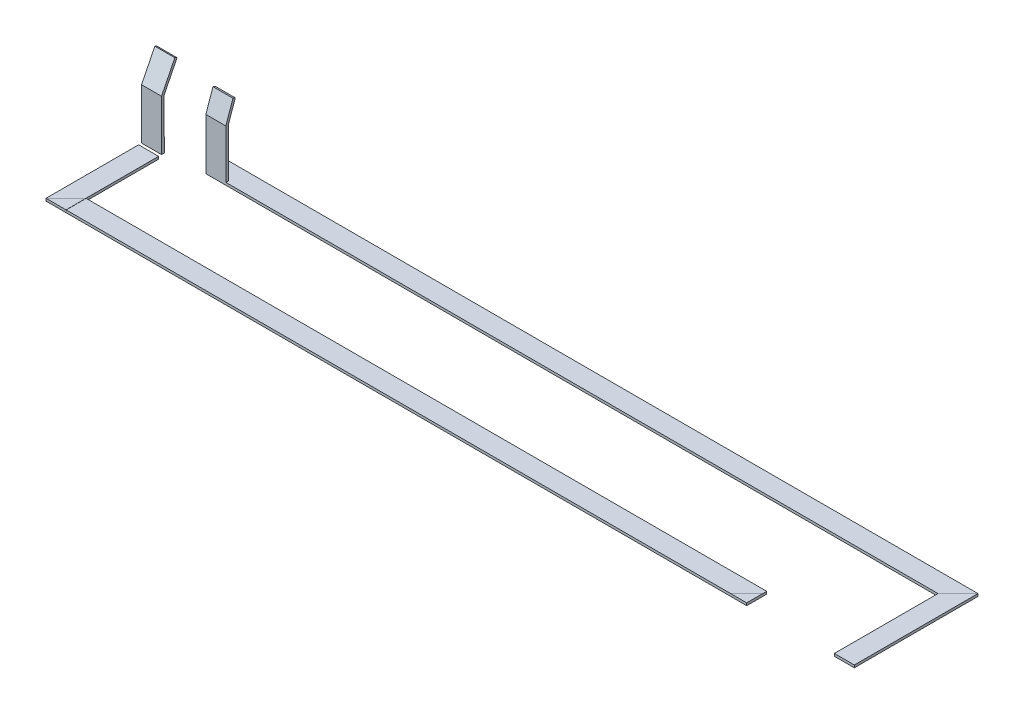
ISO-10303-21;
HEADER;
FILE_DESCRIPTION(('STEP AP214'),'2;1');
FILE_NAME('part.step','',(''),(''),'','','');
FILE_SCHEMA(('AUTOMOTIVE_DESIGN { 1 0 10303 214 1 1 1 1 }'));
ENDSEC;
DATA;
#1=APPLICATION_CONTEXT('core data for automotive mechanical design processes');
#2=APPLICATION_PROTOCOL_DEFINITION('international standard','automotive_design',2000,#1);
#3=PRODUCT_CONTEXT('',#1,'mechanical');
#4=PRODUCT('Part','Part','',(#3));
#5=PRODUCT_RELATED_PRODUCT_CATEGORY('part','',(#4));
#6=PRODUCT_DEFINITION_FORMATION('','',#4);
#7=PRODUCT_DEFINITION_CONTEXT('part definition',#1,'design');
#8=PRODUCT_DEFINITION('design','',#6,#7);
#9=PRODUCT_DEFINITION_SHAPE('','',#8);
#10=(LENGTH_UNIT() NAMED_UNIT(*) SI_UNIT(.MILLI.,.METRE.));
#11=(NAMED_UNIT(*) PLANE_ANGLE_UNIT() SI_UNIT($,.RADIAN.));
#12=(NAMED_UNIT(*) SI_UNIT($,.STERADIAN.) SOLID_ANGLE_UNIT());
#13=UNCERTAINTY_MEASURE_WITH_UNIT(LENGTH_MEASURE(1.E-05),#10,'distance_accuracy_value','');
#14=(GEOMETRIC_REPRESENTATION_CONTEXT(3) GLOBAL_UNCERTAINTY_ASSIGNED_CONTEXT((#13)) GLOBAL_UNIT_ASSIGNED_CONTEXT((#10,
#11,#12)) REPRESENTATION_CONTEXT('',''));
#15=CARTESIAN_POINT('',(0.,0.,0.));
#16=DIRECTION('',(0.,0.,1.));
#17=DIRECTION('',(1.,0.,0.));
#18=AXIS2_PLACEMENT_3D('',#15,#16,#17);
#19=CARTESIAN_POINT('',(-28.0399999999999,-570.395,341.6));
#20=DIRECTION('',(0.,1.,0.));
#21=DIRECTION('',(0.,0.,1.));
#22=AXIS2_PLACEMENT_3D('',#19,#20,#21);
#23=PLANE('',#22);
#24=DIRECTION('',(1.,0.,0.));
#25=VECTOR('',#24,1.);
#26=CARTESIAN_POINT('',(-28.0399999999999,-570.395,341.6));
#27=LINE('',#26,#25);
#28=CARTESIAN_POINT('',(72.45,-570.395,341.6));
#29=VERTEX_POINT('',#28);
#30=CARTESIAN_POINT('',(1761.3,-570.395,341.6));
#31=VERTEX_POINT('',#30);
#32=EDGE_CURVE('E100',#29,#31,#27,.T.);
#33=ORIENTED_EDGE('',*,*,#32,.F.);
#34=DIRECTION('',(0.,0.,-1.));
#35=VECTOR('',#34,1.);
#36=CARTESIAN_POINT('',(72.45,-570.395,341.6));
#37=LINE('',#36,#35);
#38=CARTESIAN_POINT('',(72.45,-570.395,290.8));
#39=VERTEX_POINT('',#38);
#40=EDGE_CURVE('E65',#29,#39,#37,.T.);
#41=ORIENTED_EDGE('',*,*,#40,.T.);
#42=DIRECTION('',(1.,0.,0.));
#43=VECTOR('',#42,1.);
#44=CARTESIAN_POINT('',(-28.0399999999999,-570.395,290.8));
#45=LINE('',#44,#43);
#46=CARTESIAN_POINT('',(1802.1,-570.395,290.8));
#47=VERTEX_POINT('',#46);
#48=EDGE_CURVE('E116',#39,#47,#45,.T.);
#49=ORIENTED_EDGE('',*,*,#48,.T.);
#50=DIRECTION('',(0.,0.,1.));
#51=VECTOR('',#50,1.);
#52=CARTESIAN_POINT('',(1802.1,-570.395,341.600000000008));
#53=LINE('',#52,#51);
#54=CARTESIAN_POINT('',(1802.1,-570.395,300.8));
#55=VERTEX_POINT('',#54);
#56=EDGE_CURVE('E114',#47,#55,#53,.T.);
#57=ORIENTED_EDGE('',*,*,#56,.T.);
#58=DIRECTION('',(0.707106781186548,0.,-0.707106781186548));
#59=VECTOR('',#58,1.);
#60=CARTESIAN_POINT('',(866.63,-570.395,1236.27));
#61=LINE('',#60,#59);
#62=EDGE_CURVE('E138',#31,#55,#61,.T.);
#63=ORIENTED_EDGE('',*,*,#62,.F.);
#64=EDGE_LOOP('',(#33,#41,#49,#57,#63));
#65=FACE_BOUND('',#64,.T.);
#66=ADVANCED_FACE('F47',(#65),#23,.F.);
#67=CARTESIAN_POINT('',(-28.0399999999999,-564.085,341.6));
#68=DIRECTION('',(0.,-1.,0.));
#69=DIRECTION('',(0.,0.,-1.));
#70=AXIS2_PLACEMENT_3D('',#67,#68,#69);
#71=PLANE('',#70);
#72=DIRECTION('',(1.,0.,0.));
#73=VECTOR('',#72,1.);
#74=CARTESIAN_POINT('',(-28.0399999999999,-564.085,290.8));
#75=LINE('',#74,#73);
#76=CARTESIAN_POINT('',(72.45,-564.085,290.8));
#77=VERTEX_POINT('',#76);
#78=CARTESIAN_POINT('',(1802.1,-564.085,290.8));
#79=VERTEX_POINT('',#78);
#80=EDGE_CURVE('E108',#77,#79,#75,.T.);
#81=ORIENTED_EDGE('',*,*,#80,.F.);
#82=DIRECTION('',(0.,0.,-1.));
#83=VECTOR('',#82,1.);
#84=CARTESIAN_POINT('',(72.45,-564.085,341.6));
#85=LINE('',#84,#83);
#86=CARTESIAN_POINT('',(72.45,-564.085,341.6));
#87=VERTEX_POINT('',#86);
#88=EDGE_CURVE('E12',#87,#77,#85,.T.);
#89=ORIENTED_EDGE('',*,*,#88,.F.);
#90=DIRECTION('',(1.,0.,0.));
#91=VECTOR('',#90,1.);
#92=CARTESIAN_POINT('',(-28.0399999999999,-564.085,341.6));
#93=LINE('',#92,#91);
#94=CARTESIAN_POINT('',(1761.3,-564.085,341.6));
#95=VERTEX_POINT('',#94);
#96=EDGE_CURVE('E50',#87,#95,#93,.T.);
#97=ORIENTED_EDGE('',*,*,#96,.T.);
#98=DIRECTION('',(-0.707106781186548,0.,0.707106781186548));
#99=VECTOR('',#98,1.);
#100=CARTESIAN_POINT('',(866.63,-564.085,1236.27));
#101=LINE('',#100,#99);
#102=CARTESIAN_POINT('',(1802.1,-564.085,300.8));
#103=VERTEX_POINT('',#102);
#104=EDGE_CURVE('E134',#103,#95,#101,.T.);
#105=ORIENTED_EDGE('',*,*,#104,.F.);
#106=DIRECTION('',(0.,0.,1.));
#107=VECTOR('',#106,1.);
#108=CARTESIAN_POINT('',(1802.1,-564.085,290.8));
#109=LINE('',#108,#107);
#110=EDGE_CURVE('E130',#79,#103,#109,.T.);
#111=ORIENTED_EDGE('',*,*,#110,.F.);
#112=EDGE_LOOP('',(#81,#89,#97,#105,#111));
#113=FACE_BOUND('',#112,.T.);
#114=ADVANCED_FACE('F104',(#113),#71,.F.);
#115=CARTESIAN_POINT('',(-28.0399999999999,-570.395,341.6));
#116=DIRECTION('',(0.,0.,-1.));
#117=DIRECTION('',(0.,1.,0.));
#118=AXIS2_PLACEMENT_3D('',#115,#116,#117);
#119=PLANE('',#118);
#120=ORIENTED_EDGE('',*,*,#96,.F.);
#121=DIRECTION('',(0.,-1.,0.));
#122=VECTOR('',#121,1.);
#123=CARTESIAN_POINT('',(72.45,-570.395,341.6));
#124=LINE('',#123,#122);
#125=EDGE_CURVE('E95',#87,#29,#124,.T.);
#126=ORIENTED_EDGE('',*,*,#125,.T.);
#127=ORIENTED_EDGE('',*,*,#32,.T.);
#128=DIRECTION('',(-1.,0.,0.));
#129=VECTOR('',#128,1.);
#130=CARTESIAN_POINT('',(1761.3,-570.395,341.6));
#131=LINE('',#130,#129);
#132=CARTESIAN_POINT('',(1802.1,-570.395,341.6));
#133=VERTEX_POINT('',#132);
#134=EDGE_CURVE('E144',#133,#31,#131,.T.);
#135=ORIENTED_EDGE('',*,*,#134,.F.);
#136=DIRECTION('',(0.,1.,0.));
#137=VECTOR('',#136,1.);
#138=CARTESIAN_POINT('',(1802.1,-570.395,341.6));
#139=LINE('',#138,#137);
#140=CARTESIAN_POINT('',(1802.1,-564.085,341.6));
#141=VERTEX_POINT('',#140);
#142=EDGE_CURVE('E135',#133,#141,#139,.T.);
#143=ORIENTED_EDGE('',*,*,#142,.T.);
#144=DIRECTION('',(1.,0.,0.));
#145=VECTOR('',#144,1.);
#146=CARTESIAN_POINT('',(1761.3,-564.085,341.6));
#147=LINE('',#146,#145);
#148=EDGE_CURVE('E113',#95,#141,#147,.T.);
#149=ORIENTED_EDGE('',*,*,#148,.F.);
#150=EDGE_LOOP('',(#120,#126,#127,#135,#143,#149));
#151=FACE_BOUND('',#150,.T.);
#152=ADVANCED_FACE('F110',(#151),#119,.F.);
#153=CARTESIAN_POINT('',(1761.3,-570.395,288.16));
#154=DIRECTION('',(0.,1.,0.));
#155=DIRECTION('',(0.,0.,1.));
#156=AXIS2_PLACEMENT_3D('',#153,#154,#155);
#157=PLANE('',#156);
#158=ORIENTED_EDGE('',*,*,#62,.T.);
#159=DIRECTION('',(0.,0.,1.));
#160=VECTOR('',#159,1.);
#161=CARTESIAN_POINT('',(1802.1,-570.395,288.16));
#162=LINE('',#161,#160);
#163=EDGE_CURVE('E125',#55,#133,#162,.T.);
#164=ORIENTED_EDGE('',*,*,#163,.T.);
#165=ORIENTED_EDGE('',*,*,#134,.T.);
#166=EDGE_LOOP('',(#158,#164,#165));
#167=FACE_BOUND('',#166,.T.);
#168=ADVANCED_FACE('F156',(#167),#157,.F.);
#169=CARTESIAN_POINT('',(1761.3,-564.085,288.16));
#170=DIRECTION('',(0.,-1.,0.));
#171=DIRECTION('',(0.,0.,-1.));
#172=AXIS2_PLACEMENT_3D('',#169,#170,#171);
#173=PLANE('',#172);
#174=ORIENTED_EDGE('',*,*,#148,.T.);
#175=EDGE_CURVE('E56',#103,#141,#109,.T.);
#176=ORIENTED_EDGE('',*,*,#175,.F.);
#177=ORIENTED_EDGE('',*,*,#104,.T.);
#178=EDGE_LOOP('',(#174,#176,#177));
#179=FACE_BOUND('',#178,.T.);
#180=ADVANCED_FACE('F147',(#179),#173,.F.);
#181=CARTESIAN_POINT('',(-28.0399999999999,-570.395,290.8));
#182=DIRECTION('',(0.,0.,1.));
#183=DIRECTION('',(0.,-1.,0.));
#184=AXIS2_PLACEMENT_3D('',#181,#182,#183);
#185=PLANE('',#184);
#186=ORIENTED_EDGE('',*,*,#48,.F.);
#187=DIRECTION('',(0.,1.,0.));
#188=VECTOR('',#187,1.);
#189=CARTESIAN_POINT('',(72.45,-574.085,290.8));
#190=LINE('',#189,#188);
#191=EDGE_CURVE('E133',#39,#77,#190,.T.);
#192=ORIENTED_EDGE('',*,*,#191,.T.);
#193=ORIENTED_EDGE('',*,*,#80,.T.);
#194=DIRECTION('',(0.,1.,0.));
#195=VECTOR('',#194,1.);
#196=CARTESIAN_POINT('',(1802.1,-617.085,290.8));
#197=LINE('',#196,#195);
#198=EDGE_CURVE('E127',#47,#79,#197,.T.);
#199=ORIENTED_EDGE('',*,*,#198,.F.);
#200=EDGE_LOOP('',(#186,#192,#193,#199));
#201=FACE_BOUND('',#200,.T.);
#202=ADVANCED_FACE('F153',(#201),#185,.F.);
#203=CARTESIAN_POINT('',(1802.1,-617.085,290.8));
#204=DIRECTION('',(-1.,0.,0.));
#205=DIRECTION('',(0.,0.,1.));
#206=AXIS2_PLACEMENT_3D('',#203,#204,#205);
#207=PLANE('',#206);
#208=ORIENTED_EDGE('',*,*,#56,.F.);
#209=ORIENTED_EDGE('',*,*,#198,.T.);
#210=ORIENTED_EDGE('',*,*,#110,.T.);
#211=ORIENTED_EDGE('',*,*,#175,.T.);
#212=ORIENTED_EDGE('',*,*,#142,.F.);
#213=ORIENTED_EDGE('',*,*,#163,.F.);
#214=EDGE_LOOP('',(#208,#209,#210,#211,#212,#213));
#215=FACE_BOUND('',#214,.T.);
#216=ADVANCED_FACE('F149',(#215),#207,.F.);
#217=CARTESIAN_POINT('',(72.45,-574.085,341.6));
#218=DIRECTION('',(1.,0.,0.));
#219=DIRECTION('',(0.,0.,-1.));
#220=AXIS2_PLACEMENT_3D('',#217,#218,#219);
#221=PLANE('',#220);
#222=ORIENTED_EDGE('',*,*,#125,.F.);
#223=ORIENTED_EDGE('',*,*,#88,.T.);
#224=ORIENTED_EDGE('',*,*,#191,.F.);
#225=ORIENTED_EDGE('',*,*,#40,.F.);
#226=EDGE_LOOP('',(#222,#223,#224,#225));
#227=FACE_BOUND('',#226,.T.);
#228=ADVANCED_FACE('F96',(#227),#221,.F.);
#229=CLOSED_SHELL('',(#66,#114,#152,#168,#180,#202,#216,#228));
#230=MANIFOLD_SOLID_BREP('B2',#229);
#231=CARTESIAN_POINT('',(71.950000000005,-564.084999999999,91.8429329999988));
#232=DIRECTION('',(0.,-1.,0.));
#233=DIRECTION('',(1.,0.,0.));
#234=AXIS2_PLACEMENT_3D('',#231,#232,#233);
#235=PLANE('',#234);
#236=DIRECTION('',(0.,0.,1.));
#237=VECTOR('',#236,1.);
#238=CARTESIAN_POINT('',(21.150000000005,-564.085,91.8429329999988));
#239=LINE('',#238,#237);
#240=CARTESIAN_POINT('',(21.150000000005,-564.085,91.8429329999988));
#241=VERTEX_POINT('',#240);
#242=CARTESIAN_POINT('',(21.150000000005,-564.085,98.7872047927987));
#243=VERTEX_POINT('',#242);
#244=EDGE_CURVE('E335',#241,#243,#239,.T.);
#245=ORIENTED_EDGE('',*,*,#244,.F.);
#246=DIRECTION('',(-1.,0.,0.));
#247=VECTOR('',#246,1.);
#248=CARTESIAN_POINT('',(71.950000000005,-564.084999999999,91.8429329999988));
#249=LINE('',#248,#247);
#250=CARTESIAN_POINT('',(71.950000000005,-564.084999999999,91.8429329999988));
#251=VERTEX_POINT('',#250);
#252=EDGE_CURVE('E45',#251,#241,#249,.T.);
#253=ORIENTED_EDGE('',*,*,#252,.F.);
#254=DIRECTION('',(0.,0.,1.));
#255=VECTOR('',#254,1.);
#256=CARTESIAN_POINT('',(71.950000000005,-564.084999999999,91.8429329999988));
#257=LINE('',#256,#255);
#258=CARTESIAN_POINT('',(71.950000000005,-564.084999999999,98.7872047927987));
#259=VERTEX_POINT('',#258);
#260=EDGE_CURVE('E349',#251,#259,#257,.T.);
#261=ORIENTED_EDGE('',*,*,#260,.T.);
#262=DIRECTION('',(-1.,0.,0.));
#263=VECTOR('',#262,1.);
#264=CARTESIAN_POINT('',(71.950000000005,-564.084999999999,98.7872047927987));
#265=LINE('',#264,#263);
#266=EDGE_CURVE('E253',#259,#243,#265,.T.);
#267=ORIENTED_EDGE('',*,*,#266,.T.);
#268=EDGE_LOOP('',(#245,#253,#261,#267));
#269=FACE_BOUND('',#268,.T.);
#270=ADVANCED_FACE('F250',(#269),#235,.T.);
#271=CARTESIAN_POINT('',(71.9500000000039,-435.843461778527,91.8975453741439));
#272=DIRECTION('',(0.,0.000425855537530922,-0.999999909323526));
#273=DIRECTION('',(0.,0.999999909323527,0.000425855537530922));
#274=AXIS2_PLACEMENT_3D('',#271,#272,#273);
#275=PLANE('',#274);
#276=DIRECTION('',(0.,-0.999999909323526,-0.000425855537530922));
#277=VECTOR('',#276,1.);
#278=CARTESIAN_POINT('',(21.1500000000039,-435.843461778528,91.8975453741439));
#279=LINE('',#278,#277);
#280=CARTESIAN_POINT('',(21.1500000000039,-435.843461778528,91.8975453741439));
#281=VERTEX_POINT('',#280);
#282=EDGE_CURVE('E347',#281,#241,#279,.T.);
#283=ORIENTED_EDGE('',*,*,#282,.F.);
#284=DIRECTION('',(-1.,0.,0.));
#285=VECTOR('',#284,1.);
#286=CARTESIAN_POINT('',(71.9500000000039,-435.843461778527,91.8975453741439));
#287=LINE('',#286,#285);
#288=CARTESIAN_POINT('',(71.9500000000039,-435.843461778527,91.8975453741439));
#289=VERTEX_POINT('',#288);
#290=EDGE_CURVE('E259',#289,#281,#287,.T.);
#291=ORIENTED_EDGE('',*,*,#290,.F.);
#292=DIRECTION('',(0.,-0.999999909323526,-0.000425855537530922));
#293=VECTOR('',#292,1.);
#294=CARTESIAN_POINT('',(71.9500000000039,-435.843461778527,91.8975453741439));
#295=LINE('',#294,#293);
#296=EDGE_CURVE('E325',#289,#251,#295,.T.);
#297=ORIENTED_EDGE('',*,*,#296,.T.);
#298=ORIENTED_EDGE('',*,*,#252,.T.);
#299=EDGE_LOOP('',(#283,#291,#297,#298));
#300=FACE_BOUND('',#299,.T.);
#301=ADVANCED_FACE('F357',(#300),#275,.T.);
#302=CARTESIAN_POINT('',(71.9500000000033,-370.435814977783,59.3217377769626));
#303=DIRECTION('',(0.,-0.445811493071442,-0.895126869580738));
#304=DIRECTION('',(0.,0.895126869580738,-0.445811493071442));
#305=AXIS2_PLACEMENT_3D('',#302,#303,#304);
#306=PLANE('',#305);
#307=DIRECTION('',(0.,-0.895126869580738,0.445811493071442));
#308=VECTOR('',#307,1.);
#309=CARTESIAN_POINT('',(21.1500000000033,-370.435814977783,59.3217377769626));
#310=LINE('',#309,#308);
#311=CARTESIAN_POINT('',(21.1500000000033,-370.435814977783,59.3217377769626));
#312=VERTEX_POINT('',#311);
#313=EDGE_CURVE('E312',#312,#281,#310,.T.);
#314=ORIENTED_EDGE('',*,*,#313,.F.);
#315=DIRECTION('',(-1.,0.,0.));
#316=VECTOR('',#315,1.);
#317=CARTESIAN_POINT('',(71.9500000000033,-370.435814977783,59.3217377769626));
#318=LINE('',#317,#316);
#319=CARTESIAN_POINT('',(71.9500000000033,-370.435814977783,59.3217377769626));
#320=VERTEX_POINT('',#319);
#321=EDGE_CURVE('E307',#320,#312,#318,.T.);
#322=ORIENTED_EDGE('',*,*,#321,.F.);
#323=DIRECTION('',(0.,-0.895126869580738,0.445811493071442));
#324=VECTOR('',#323,1.);
#325=CARTESIAN_POINT('',(71.9500000000033,-370.435814977783,59.3217377769626));
#326=LINE('',#325,#324);
#327=EDGE_CURVE('E310',#320,#289,#326,.T.);
#328=ORIENTED_EDGE('',*,*,#327,.T.);
#329=ORIENTED_EDGE('',*,*,#290,.T.);
#330=EDGE_LOOP('',(#314,#322,#328,#329));
#331=FACE_BOUND('',#330,.T.);
#332=ADVANCED_FACE('F309',(#331),#306,.T.);
#333=CARTESIAN_POINT('',(71.9500000000033,-367.622744456502,64.969988324017));
#334=DIRECTION('',(0.,0.895126869580736,-0.445811493071446));
#335=DIRECTION('',(0.,0.445811493071446,0.895126869580736));
#336=AXIS2_PLACEMENT_3D('',#333,#334,#335);
#337=PLANE('',#336);
#338=DIRECTION('',(0.,-0.445811493071446,-0.895126869580736));
#339=VECTOR('',#338,1.);
#340=CARTESIAN_POINT('',(21.1500000000033,-367.622744456503,64.969988324017));
#341=LINE('',#340,#339);
#342=CARTESIAN_POINT('',(21.1500000000033,-367.622744456503,64.969988324017));
#343=VERTEX_POINT('',#342);
#344=EDGE_CURVE('E344',#343,#312,#341,.T.);
#345=ORIENTED_EDGE('',*,*,#344,.F.);
#346=DIRECTION('',(-1.,0.,0.));
#347=VECTOR('',#346,1.);
#348=CARTESIAN_POINT('',(71.9500000000033,-367.622744456502,64.969988324017));
#349=LINE('',#348,#347);
#350=CARTESIAN_POINT('',(71.9500000000033,-367.622744456502,64.969988324017));
#351=VERTEX_POINT('',#350);
#352=EDGE_CURVE('E317',#351,#343,#349,.T.);
#353=ORIENTED_EDGE('',*,*,#352,.F.);
#354=DIRECTION('',(0.,-0.445811493071446,-0.895126869580736));
#355=VECTOR('',#354,1.);
#356=CARTESIAN_POINT('',(71.9500000000033,-367.622744456502,64.969988324017));
#357=LINE('',#356,#355);
#358=EDGE_CURVE('E323',#351,#320,#357,.T.);
#359=ORIENTED_EDGE('',*,*,#358,.T.);
#360=ORIENTED_EDGE('',*,*,#321,.T.);
#361=EDGE_LOOP('',(#345,#353,#359,#360));
#362=FACE_BOUND('',#361,.T.);
#363=ADVANCED_FACE('F327',(#362),#337,.T.);
#364=CARTESIAN_POINT('',(71.9500000000039,-435.522965931465,98.7872047927987));
#365=DIRECTION('',(0.,0.445811493071442,0.895126869580738));
#366=DIRECTION('',(0.,-0.895126869580738,0.445811493071442));
#367=AXIS2_PLACEMENT_3D('',#364,#365,#366);
#368=PLANE('',#367);
#369=DIRECTION('',(0.,0.895126869580738,-0.445811493071442));
#370=VECTOR('',#369,1.);
#371=CARTESIAN_POINT('',(21.1500000000039,-435.522965931465,98.7872047927987));
#372=LINE('',#371,#370);
#373=CARTESIAN_POINT('',(21.1500000000039,-435.522965931465,98.7872047927987));
#374=VERTEX_POINT('',#373);
#375=EDGE_CURVE('E341',#374,#343,#372,.T.);
#376=ORIENTED_EDGE('',*,*,#375,.F.);
#377=DIRECTION('',(-1.,0.,0.));
#378=VECTOR('',#377,1.);
#379=CARTESIAN_POINT('',(71.9500000000039,-435.522965931465,98.7872047927987));
#380=LINE('',#379,#378);
#381=CARTESIAN_POINT('',(71.9500000000039,-435.522965931465,98.7872047927987));
#382=VERTEX_POINT('',#381);
#383=EDGE_CURVE('E352',#382,#374,#380,.T.);
#384=ORIENTED_EDGE('',*,*,#383,.F.);
#385=DIRECTION('',(0.,0.895126869580738,-0.445811493071442));
#386=VECTOR('',#385,1.);
#387=CARTESIAN_POINT('',(71.9500000000039,-435.522965931465,98.7872047927987));
#388=LINE('',#387,#386);
#389=EDGE_CURVE('E328',#382,#351,#388,.T.);
#390=ORIENTED_EDGE('',*,*,#389,.T.);
#391=ORIENTED_EDGE('',*,*,#352,.T.);
#392=EDGE_LOOP('',(#376,#384,#390,#391));
#393=FACE_BOUND('',#392,.T.);
#394=ADVANCED_FACE('F370',(#393),#368,.T.);
#395=CARTESIAN_POINT('',(71.950000000005,-564.084999999999,98.7872047927987));
#396=DIRECTION('',(0.,0.,1.));
#397=DIRECTION('',(1.,0.,0.));
#398=AXIS2_PLACEMENT_3D('',#395,#396,#397);
#399=PLANE('',#398);
#400=DIRECTION('',(0.,1.,0.));
#401=VECTOR('',#400,1.);
#402=CARTESIAN_POINT('',(21.150000000005,-564.085,98.7872047927987));
#403=LINE('',#402,#401);
#404=EDGE_CURVE('E338',#243,#374,#403,.T.);
#405=ORIENTED_EDGE('',*,*,#404,.F.);
#406=ORIENTED_EDGE('',*,*,#266,.F.);
#407=DIRECTION('',(0.,1.,0.));
#408=VECTOR('',#407,1.);
#409=CARTESIAN_POINT('',(71.950000000005,-564.084999999999,98.7872047927987));
#410=LINE('',#409,#408);
#411=EDGE_CURVE('E330',#259,#382,#410,.T.);
#412=ORIENTED_EDGE('',*,*,#411,.T.);
#413=ORIENTED_EDGE('',*,*,#383,.T.);
#414=EDGE_LOOP('',(#405,#406,#412,#413));
#415=FACE_BOUND('',#414,.T.);
#416=ADVANCED_FACE('F354',(#415),#399,.T.);
#417=CARTESIAN_POINT('',(71.9500000000001,6.32973982890031E-13,0.));
#418=DIRECTION('',(-1.,0.,0.));
#419=DIRECTION('',(0.,-1.,0.));
#420=AXIS2_PLACEMENT_3D('',#417,#418,#419);
#421=PLANE('',#420);
#422=ORIENTED_EDGE('',*,*,#260,.F.);
#423=ORIENTED_EDGE('',*,*,#296,.F.);
#424=ORIENTED_EDGE('',*,*,#327,.F.);
#425=ORIENTED_EDGE('',*,*,#358,.F.);
#426=ORIENTED_EDGE('',*,*,#389,.F.);
#427=ORIENTED_EDGE('',*,*,#411,.F.);
#428=EDGE_LOOP('',(#422,#423,#424,#425,#426,#427));
#429=FACE_BOUND('',#428,.T.);
#430=ADVANCED_FACE('F321',(#429),#421,.F.);
#431=CARTESIAN_POINT('',(21.1500000000001,1.8606962749417E-13,0.));
#432=DIRECTION('',(-1.,0.,0.));
#433=DIRECTION('',(0.,-1.,0.));
#434=AXIS2_PLACEMENT_3D('',#431,#432,#433);
#435=PLANE('',#434);
#436=ORIENTED_EDGE('',*,*,#244,.T.);
#437=ORIENTED_EDGE('',*,*,#404,.T.);
#438=ORIENTED_EDGE('',*,*,#375,.T.);
#439=ORIENTED_EDGE('',*,*,#344,.T.);
#440=ORIENTED_EDGE('',*,*,#313,.T.);
#441=ORIENTED_EDGE('',*,*,#282,.T.);
#442=EDGE_LOOP('',(#436,#437,#438,#439,#440,#441));
#443=FACE_BOUND('',#442,.T.);
#444=ADVANCED_FACE('F356',(#443),#435,.T.);
#445=CLOSED_SHELL('',(#270,#301,#332,#363,#394,#416,#430,#444));
#446=MANIFOLD_SOLID_BREP('B6',#445);
#447=CARTESIAN_POINT('',(2024.8,-570.395,-1.68999999999975));
#448=DIRECTION('',(0.,1.,0.));
#449=DIRECTION('',(0.,0.,1.));
#450=AXIS2_PLACEMENT_3D('',#447,#448,#449);
#451=PLANE('',#450);
#452=DIRECTION('',(0.,0.,1.));
#453=VECTOR('',#452,1.);
#454=CARTESIAN_POINT('',(2075.6,-570.395,-1.68999999999975));
#455=LINE('',#454,#453);
#456=CARTESIAN_POINT('',(2075.6,-570.395,27.3000000000001));
#457=VERTEX_POINT('',#456);
#458=CARTESIAN_POINT('',(2075.6,-570.395,341.6));
#459=VERTEX_POINT('',#458);
#460=EDGE_CURVE('E586',#457,#459,#455,.T.);
#461=ORIENTED_EDGE('',*,*,#460,.T.);
#462=DIRECTION('',(-1.,0.,0.));
#463=VECTOR('',#462,1.);
#464=CARTESIAN_POINT('',(2024.8,-570.395,341.6));
#465=LINE('',#464,#463);
#466=CARTESIAN_POINT('',(2024.8,-570.395,341.6));
#467=VERTEX_POINT('',#466);
#468=EDGE_CURVE('E583',#459,#467,#465,.T.);
#469=ORIENTED_EDGE('',*,*,#468,.T.);
#470=DIRECTION('',(0.,0.,1.));
#471=VECTOR('',#470,1.);
#472=CARTESIAN_POINT('',(2024.8,-570.395,-1.68999999999975));
#473=LINE('',#472,#471);
#474=CARTESIAN_POINT('',(2024.8,-570.395,78.1));
#475=VERTEX_POINT('',#474);
#476=EDGE_CURVE('E600',#475,#467,#473,.T.);
#477=ORIENTED_EDGE('',*,*,#476,.F.);
#478=DIRECTION('',(0.707106781186548,0.,-0.707106781186548));
#479=VECTOR('',#478,1.);
#480=CARTESIAN_POINT('',(1012.4,-570.395,1090.5));
#481=LINE('',#480,#479);
#482=EDGE_CURVE('E592',#475,#457,#481,.T.);
#483=ORIENTED_EDGE('',*,*,#482,.T.);
#484=EDGE_LOOP('',(#461,#469,#477,#483));
#485=FACE_BOUND('',#484,.T.);
#486=ADVANCED_FACE('F438',(#485),#451,.F.);
#487=CARTESIAN_POINT('',(2075.6,-570.395,-1.68999999999975));
#488=DIRECTION('',(-1.,0.,0.));
#489=DIRECTION('',(0.,0.,1.));
#490=AXIS2_PLACEMENT_3D('',#487,#488,#489);
#491=PLANE('',#490);
#492=DIRECTION('',(0.,0.,1.));
#493=VECTOR('',#492,1.);
#494=CARTESIAN_POINT('',(2075.6,-564.085,-1.68999999999975));
#495=LINE('',#494,#493);
#496=CARTESIAN_POINT('',(2075.6,-564.085,27.3000000000001));
#497=VERTEX_POINT('',#496);
#498=CARTESIAN_POINT('',(2075.6,-564.085,341.6));
#499=VERTEX_POINT('',#498);
#500=EDGE_CURVE('E610',#497,#499,#495,.T.);
#501=ORIENTED_EDGE('',*,*,#500,.T.);
#502=DIRECTION('',(0.,1.,0.));
#503=VECTOR('',#502,1.);
#504=CARTESIAN_POINT('',(2075.6,-934.31778313,341.6));
#505=LINE('',#504,#503);
#506=EDGE_CURVE('E576',#459,#499,#505,.T.);
#507=ORIENTED_EDGE('',*,*,#506,.F.);
#508=ORIENTED_EDGE('',*,*,#460,.F.);
#509=DIRECTION('',(0.,1.,0.));
#510=VECTOR('',#509,1.);
#511=CARTESIAN_POINT('',(2075.6,-570.395,27.2999999999999));
#512=LINE('',#511,#510);
#513=EDGE_CURVE('E589',#457,#497,#512,.T.);
#514=ORIENTED_EDGE('',*,*,#513,.T.);
#515=EDGE_LOOP('',(#501,#507,#508,#514));
#516=FACE_BOUND('',#515,.T.);
#517=ADVANCED_FACE('F627',(#516),#491,.F.);
#518=CARTESIAN_POINT('',(2024.8,-564.085,-1.68999999999975));
#519=DIRECTION('',(0.,-1.,0.));
#520=DIRECTION('',(0.,0.,-1.));
#521=AXIS2_PLACEMENT_3D('',#518,#519,#520);
#522=PLANE('',#521);
#523=DIRECTION('',(0.,0.,1.));
#524=VECTOR('',#523,1.);
#525=CARTESIAN_POINT('',(2024.8,-564.085,-1.68999999999975));
#526=LINE('',#525,#524);
#527=CARTESIAN_POINT('',(2024.8,-564.085,78.1));
#528=VERTEX_POINT('',#527);
#529=CARTESIAN_POINT('',(2024.8,-564.085,341.6));
#530=VERTEX_POINT('',#529);
#531=EDGE_CURVE('E613',#528,#530,#526,.T.);
#532=ORIENTED_EDGE('',*,*,#531,.T.);
#533=DIRECTION('',(1.,0.,0.));
#534=VECTOR('',#533,1.);
#535=CARTESIAN_POINT('',(2024.8,-564.085,341.6));
#536=LINE('',#535,#534);
#537=EDGE_CURVE('E580',#530,#499,#536,.T.);
#538=ORIENTED_EDGE('',*,*,#537,.T.);
#539=ORIENTED_EDGE('',*,*,#500,.F.);
#540=DIRECTION('',(-0.707106781186548,0.,0.707106781186548));
#541=VECTOR('',#540,1.);
#542=CARTESIAN_POINT('',(1012.4,-564.085,1090.5));
#543=LINE('',#542,#541);
#544=EDGE_CURVE('E445',#497,#528,#543,.T.);
#545=ORIENTED_EDGE('',*,*,#544,.T.);
#546=EDGE_LOOP('',(#532,#538,#539,#545));
#547=FACE_BOUND('',#546,.T.);
#548=ADVANCED_FACE('F630',(#547),#522,.F.);
#549=CARTESIAN_POINT('',(2024.8,-570.395,-1.68999999999975));
#550=DIRECTION('',(1.,0.,0.));
#551=DIRECTION('',(0.,0.,-1.));
#552=AXIS2_PLACEMENT_3D('',#549,#550,#551);
#553=PLANE('',#552);
#554=ORIENTED_EDGE('',*,*,#476,.T.);
#555=DIRECTION('',(0.,1.,0.));
#556=VECTOR('',#555,1.);
#557=CARTESIAN_POINT('',(2024.8,-570.395,341.6));
#558=LINE('',#557,#556);
#559=EDGE_CURVE('E248',#467,#530,#558,.T.);
#560=ORIENTED_EDGE('',*,*,#559,.T.);
#561=ORIENTED_EDGE('',*,*,#531,.F.);
#562=DIRECTION('',(0.,-1.,0.));
#563=VECTOR('',#562,1.);
#564=CARTESIAN_POINT('',(2024.8,-570.395,78.1));
#565=LINE('',#564,#563);
#566=EDGE_CURVE('E595',#528,#475,#565,.T.);
#567=ORIENTED_EDGE('',*,*,#566,.T.);
#568=EDGE_LOOP('',(#554,#560,#561,#567));
#569=FACE_BOUND('',#568,.T.);
#570=ADVANCED_FACE('F618',(#569),#553,.F.);
#571=CARTESIAN_POINT('',(0.,-570.395,78.1));
#572=DIRECTION('',(0.,1.,0.));
#573=DIRECTION('',(0.,0.,1.));
#574=AXIS2_PLACEMENT_3D('',#571,#572,#573);
#575=PLANE('',#574);
#576=DIRECTION('',(1.,0.,0.));
#577=VECTOR('',#576,1.);
#578=CARTESIAN_POINT('',(0.,-570.395,78.1));
#579=LINE('',#578,#577);
#580=CARTESIAN_POINT('',(163.9,-570.395,78.1));
#581=VERTEX_POINT('',#580);
#582=EDGE_CURVE('E604',#581,#475,#579,.T.);
#583=ORIENTED_EDGE('',*,*,#582,.F.);
#584=DIRECTION('',(0.,0.,1.));
#585=VECTOR('',#584,1.);
#586=CARTESIAN_POINT('',(163.9,-570.395,27.3));
#587=LINE('',#586,#585);
#588=CARTESIAN_POINT('',(163.9,-570.395,27.3));
#589=VERTEX_POINT('',#588);
#590=EDGE_CURVE('E569',#589,#581,#587,.T.);
#591=ORIENTED_EDGE('',*,*,#590,.F.);
#592=DIRECTION('',(1.,0.,0.));
#593=VECTOR('',#592,1.);
#594=CARTESIAN_POINT('',(0.,-570.395,27.2999999999999));
#595=LINE('',#594,#593);
#596=EDGE_CURVE('E596',#589,#457,#595,.T.);
#597=ORIENTED_EDGE('',*,*,#596,.T.);
#598=ORIENTED_EDGE('',*,*,#482,.F.);
#599=EDGE_LOOP('',(#583,#591,#597,#598));
#600=FACE_BOUND('',#599,.T.);
#601=ADVANCED_FACE('F634',(#600),#575,.F.);
#602=CARTESIAN_POINT('',(0.,-570.395,27.2999999999999));
#603=DIRECTION('',(0.,0.,1.));
#604=DIRECTION('',(0.,-1.,0.));
#605=AXIS2_PLACEMENT_3D('',#602,#603,#604);
#606=PLANE('',#605);
#607=ORIENTED_EDGE('',*,*,#596,.F.);
#608=DIRECTION('',(0.,1.,0.));
#609=VECTOR('',#608,1.);
#610=CARTESIAN_POINT('',(163.9,-570.395,27.3));
#611=LINE('',#610,#609);
#612=CARTESIAN_POINT('',(163.9,-564.085,27.3));
#613=VERTEX_POINT('',#612);
#614=EDGE_CURVE('E572',#589,#613,#611,.T.);
#615=ORIENTED_EDGE('',*,*,#614,.T.);
#616=DIRECTION('',(1.,0.,0.));
#617=VECTOR('',#616,1.);
#618=CARTESIAN_POINT('',(0.,-564.085,27.2999999999999));
#619=LINE('',#618,#617);
#620=EDGE_CURVE('E599',#613,#497,#619,.T.);
#621=ORIENTED_EDGE('',*,*,#620,.T.);
#622=ORIENTED_EDGE('',*,*,#513,.F.);
#623=EDGE_LOOP('',(#607,#615,#621,#622));
#624=FACE_BOUND('',#623,.T.);
#625=ADVANCED_FACE('F637',(#624),#606,.F.);
#626=CARTESIAN_POINT('',(0.,-564.085,78.1));
#627=DIRECTION('',(0.,-1.,0.));
#628=DIRECTION('',(0.,0.,-1.));
#629=AXIS2_PLACEMENT_3D('',#626,#627,#628);
#630=PLANE('',#629);
#631=DIRECTION('',(0.,0.,1.));
#632=VECTOR('',#631,1.);
#633=CARTESIAN_POINT('',(163.9,-564.085,27.3));
#634=LINE('',#633,#632);
#635=CARTESIAN_POINT('',(163.9,-564.085,71.79));
#636=VERTEX_POINT('',#635);
#637=EDGE_CURVE('E563',#613,#636,#634,.T.);
#638=ORIENTED_EDGE('',*,*,#637,.T.);
#639=DIRECTION('',(-1.,0.,0.));
#640=VECTOR('',#639,1.);
#641=CARTESIAN_POINT('',(214.7,-564.085,71.79));
#642=LINE('',#641,#640);
#643=CARTESIAN_POINT('',(214.7,-564.085,71.79));
#644=VERTEX_POINT('',#643);
#645=EDGE_CURVE('E452',#644,#636,#642,.T.);
#646=ORIENTED_EDGE('',*,*,#645,.F.);
#647=DIRECTION('',(0.,0.,1.));
#648=VECTOR('',#647,1.);
#649=CARTESIAN_POINT('',(214.7,-564.085,71.79));
#650=LINE('',#649,#648);
#651=CARTESIAN_POINT('',(214.7,-564.085,78.1));
#652=VERTEX_POINT('',#651);
#653=EDGE_CURVE('E456',#644,#652,#650,.T.);
#654=ORIENTED_EDGE('',*,*,#653,.T.);
#655=DIRECTION('',(1.,0.,0.));
#656=VECTOR('',#655,1.);
#657=CARTESIAN_POINT('',(0.,-564.085,78.1));
#658=LINE('',#657,#656);
#659=EDGE_CURVE('E542',#652,#528,#658,.T.);
#660=ORIENTED_EDGE('',*,*,#659,.T.);
#661=ORIENTED_EDGE('',*,*,#544,.F.);
#662=ORIENTED_EDGE('',*,*,#620,.F.);
#663=EDGE_LOOP('',(#638,#646,#654,#660,#661,#662));
#664=FACE_BOUND('',#663,.T.);
#665=ADVANCED_FACE('F631',(#664),#630,.F.);
#666=CARTESIAN_POINT('',(0.,-570.395,78.1));
#667=DIRECTION('',(0.,0.,-1.));
#668=DIRECTION('',(0.,1.,0.));
#669=AXIS2_PLACEMENT_3D('',#666,#667,#668);
#670=PLANE('',#669);
#671=ORIENTED_EDGE('',*,*,#659,.F.);
#672=DIRECTION('',(0.,1.,0.));
#673=VECTOR('',#672,1.);
#674=CARTESIAN_POINT('',(214.7,-564.085,78.1));
#675=LINE('',#674,#673);
#676=CARTESIAN_POINT('',(214.7,-439.884522325931,78.1));
#677=VERTEX_POINT('',#676);
#678=EDGE_CURVE('E535',#652,#677,#675,.T.);
#679=ORIENTED_EDGE('',*,*,#678,.T.);
#680=DIRECTION('',(-1.,0.,0.));
#681=VECTOR('',#680,1.);
#682=CARTESIAN_POINT('',(214.7,-439.884522325931,78.1));
#683=LINE('',#682,#681);
#684=CARTESIAN_POINT('',(163.9,-439.884522325931,78.1));
#685=VERTEX_POINT('',#684);
#686=EDGE_CURVE('E519',#677,#685,#683,.T.);
#687=ORIENTED_EDGE('',*,*,#686,.T.);
#688=DIRECTION('',(0.,1.,0.));
#689=VECTOR('',#688,1.);
#690=CARTESIAN_POINT('',(163.9,-570.395,78.1));
#691=LINE('',#690,#689);
#692=EDGE_CURVE('E574',#581,#685,#691,.T.);
#693=ORIENTED_EDGE('',*,*,#692,.F.);
#694=ORIENTED_EDGE('',*,*,#582,.T.);
#695=ORIENTED_EDGE('',*,*,#566,.F.);
#696=EDGE_LOOP('',(#671,#679,#687,#693,#694,#695));
#697=FACE_BOUND('',#696,.T.);
#698=ADVANCED_FACE('F540',(#697),#670,.F.);
#699=CARTESIAN_POINT('',(1761.3,-934.31778313,341.6));
#700=DIRECTION('',(0.,0.,-1.));
#701=DIRECTION('',(-1.,0.,0.));
#702=AXIS2_PLACEMENT_3D('',#699,#700,#701);
#703=PLANE('',#702);
#704=ORIENTED_EDGE('',*,*,#506,.T.);
#705=ORIENTED_EDGE('',*,*,#537,.F.);
#706=ORIENTED_EDGE('',*,*,#559,.F.);
#707=ORIENTED_EDGE('',*,*,#468,.F.);
#708=EDGE_LOOP('',(#704,#705,#706,#707));
#709=FACE_BOUND('',#708,.T.);
#710=ADVANCED_FACE('F625',(#709),#703,.F.);
#711=CARTESIAN_POINT('',(163.9,-570.395,27.3));
#712=DIRECTION('',(-1.,0.,0.));
#713=DIRECTION('',(0.,0.,1.));
#714=AXIS2_PLACEMENT_3D('',#711,#712,#713);
#715=PLANE('',#714);
#716=ORIENTED_EDGE('',*,*,#637,.F.);
#717=ORIENTED_EDGE('',*,*,#614,.F.);
#718=ORIENTED_EDGE('',*,*,#590,.T.);
#719=ORIENTED_EDGE('',*,*,#692,.T.);
#720=DIRECTION('',(0.,0.944150983339285,-0.329513157035438));
#721=VECTOR('',#720,1.);
#722=CARTESIAN_POINT('',(163.9,-439.884522325931,78.1));
#723=LINE('',#722,#721);
#724=CARTESIAN_POINT('',(163.9,-387.92551527643,59.9660608828121));
#725=VERTEX_POINT('',#724);
#726=EDGE_CURVE('E524',#685,#725,#723,.T.);
#727=ORIENTED_EDGE('',*,*,#726,.T.);
#728=DIRECTION('',(0.,-0.329513157035437,-0.944150983339285));
#729=VECTOR('',#728,1.);
#730=CARTESIAN_POINT('',(163.9,-387.92551527643,59.9660608828121));
#731=LINE('',#730,#729);
#732=CARTESIAN_POINT('',(163.9,-390.004743297324,54.0084681779412));
#733=VERTEX_POINT('',#732);
#734=EDGE_CURVE('E554',#725,#733,#731,.T.);
#735=ORIENTED_EDGE('',*,*,#734,.T.);
#736=DIRECTION('',(0.,-0.944150983339285,0.329513157035439));
#737=VECTOR('',#736,1.);
#738=CARTESIAN_POINT('',(163.9,-390.004743297324,54.0084681779412));
#739=LINE('',#738,#737);
#740=CARTESIAN_POINT('',(163.9,-440.954001002593,71.79));
#741=VERTEX_POINT('',#740);
#742=EDGE_CURVE('E557',#733,#741,#739,.T.);
#743=ORIENTED_EDGE('',*,*,#742,.T.);
#744=DIRECTION('',(0.,-1.,0.));
#745=VECTOR('',#744,1.);
#746=CARTESIAN_POINT('',(163.9,-440.954001002593,71.79));
#747=LINE('',#746,#745);
#748=EDGE_CURVE('E544',#741,#636,#747,.T.);
#749=ORIENTED_EDGE('',*,*,#748,.T.);
#750=EDGE_LOOP('',(#716,#717,#718,#719,#727,#735,#743,#749));
#751=FACE_BOUND('',#750,.T.);
#752=ADVANCED_FACE('F640',(#751),#715,.T.);
#753=CARTESIAN_POINT('',(214.7,-440.954001002593,71.79));
#754=DIRECTION('',(0.,0.,-1.));
#755=DIRECTION('',(0.,1.,0.));
#756=AXIS2_PLACEMENT_3D('',#753,#754,#755);
#757=PLANE('',#756);
#758=ORIENTED_EDGE('',*,*,#748,.F.);
#759=DIRECTION('',(-1.,0.,0.));
#760=VECTOR('',#759,1.);
#761=CARTESIAN_POINT('',(214.7,-440.954001002593,71.79));
#762=LINE('',#761,#760);
#763=CARTESIAN_POINT('',(214.7,-440.954001002593,71.79));
#764=VERTEX_POINT('',#763);
#765=EDGE_CURVE('E564',#764,#741,#762,.T.);
#766=ORIENTED_EDGE('',*,*,#765,.F.);
#767=DIRECTION('',(0.,-1.,0.));
#768=VECTOR('',#767,1.);
#769=CARTESIAN_POINT('',(214.7,-440.954001002593,71.79));
#770=LINE('',#769,#768);
#771=EDGE_CURVE('E529',#764,#644,#770,.T.);
#772=ORIENTED_EDGE('',*,*,#771,.T.);
#773=ORIENTED_EDGE('',*,*,#645,.T.);
#774=EDGE_LOOP('',(#758,#766,#772,#773));
#775=FACE_BOUND('',#774,.T.);
#776=ADVANCED_FACE('F643',(#775),#757,.T.);
#777=CARTESIAN_POINT('',(214.7,-390.004743297324,54.0084681779412));
#778=DIRECTION('',(0.,-0.329513157035439,-0.944150983339285));
#779=DIRECTION('',(0.,0.944150983339285,-0.329513157035439));
#780=AXIS2_PLACEMENT_3D('',#777,#778,#779);
#781=PLANE('',#780);
#782=ORIENTED_EDGE('',*,*,#742,.F.);
#783=DIRECTION('',(-1.,0.,0.));
#784=VECTOR('',#783,1.);
#785=CARTESIAN_POINT('',(214.7,-390.004743297324,54.0084681779412));
#786=LINE('',#785,#784);
#787=CARTESIAN_POINT('',(214.7,-390.004743297324,54.0084681779412));
#788=VERTEX_POINT('',#787);
#789=EDGE_CURVE('E566',#788,#733,#786,.T.);
#790=ORIENTED_EDGE('',*,*,#789,.F.);
#791=DIRECTION('',(0.,-0.944150983339285,0.329513157035439));
#792=VECTOR('',#791,1.);
#793=CARTESIAN_POINT('',(214.7,-390.004743297324,54.0084681779412));
#794=LINE('',#793,#792);
#795=EDGE_CURVE('E548',#788,#764,#794,.T.);
#796=ORIENTED_EDGE('',*,*,#795,.T.);
#797=ORIENTED_EDGE('',*,*,#765,.T.);
#798=EDGE_LOOP('',(#782,#790,#796,#797));
#799=FACE_BOUND('',#798,.T.);
#800=ADVANCED_FACE('F650',(#799),#781,.T.);
#801=CARTESIAN_POINT('',(214.7,-387.92551527643,59.9660608828121));
#802=DIRECTION('',(0.,0.944150983339285,-0.329513157035437));
#803=DIRECTION('',(0.,0.329513157035437,0.944150983339285));
#804=AXIS2_PLACEMENT_3D('',#801,#802,#803);
#805=PLANE('',#804);
#806=ORIENTED_EDGE('',*,*,#734,.F.);
#807=DIRECTION('',(-1.,0.,0.));
#808=VECTOR('',#807,1.);
#809=CARTESIAN_POINT('',(214.7,-387.92551527643,59.9660608828121));
#810=LINE('',#809,#808);
#811=CARTESIAN_POINT('',(214.7,-387.92551527643,59.9660608828121));
#812=VERTEX_POINT('',#811);
#813=EDGE_CURVE('E528',#812,#725,#810,.T.);
#814=ORIENTED_EDGE('',*,*,#813,.F.);
#815=DIRECTION('',(0.,-0.329513157035437,-0.944150983339285));
#816=VECTOR('',#815,1.);
#817=CARTESIAN_POINT('',(214.7,-387.92551527643,59.9660608828121));
#818=LINE('',#817,#816);
#819=EDGE_CURVE('E538',#812,#788,#818,.T.);
#820=ORIENTED_EDGE('',*,*,#819,.T.);
#821=ORIENTED_EDGE('',*,*,#789,.T.);
#822=EDGE_LOOP('',(#806,#814,#820,#821));
#823=FACE_BOUND('',#822,.T.);
#824=ADVANCED_FACE('F648',(#823),#805,.T.);
#825=CARTESIAN_POINT('',(214.7,-439.884522325931,78.1));
#826=DIRECTION('',(0.,0.329513157035438,0.944150983339285));
#827=DIRECTION('',(0.,-0.944150983339285,0.329513157035438));
#828=AXIS2_PLACEMENT_3D('',#825,#826,#827);
#829=PLANE('',#828);
#830=ORIENTED_EDGE('',*,*,#726,.F.);
#831=ORIENTED_EDGE('',*,*,#686,.F.);
#832=DIRECTION('',(0.,0.944150983339285,-0.329513157035438));
#833=VECTOR('',#832,1.);
#834=CARTESIAN_POINT('',(214.7,-439.884522325931,78.1));
#835=LINE('',#834,#833);
#836=EDGE_CURVE('E522',#677,#812,#835,.T.);
#837=ORIENTED_EDGE('',*,*,#836,.T.);
#838=ORIENTED_EDGE('',*,*,#813,.T.);
#839=EDGE_LOOP('',(#830,#831,#837,#838));
#840=FACE_BOUND('',#839,.T.);
#841=ADVANCED_FACE('F521',(#840),#829,.T.);
#842=CARTESIAN_POINT('',(214.7,0.,0.));
#843=DIRECTION('',(-1.,0.,0.));
#844=DIRECTION('',(0.,0.,1.));
#845=AXIS2_PLACEMENT_3D('',#842,#843,#844);
#846=PLANE('',#845);
#847=ORIENTED_EDGE('',*,*,#653,.F.);
#848=ORIENTED_EDGE('',*,*,#771,.F.);
#849=ORIENTED_EDGE('',*,*,#795,.F.);
#850=ORIENTED_EDGE('',*,*,#819,.F.);
#851=ORIENTED_EDGE('',*,*,#836,.F.);
#852=ORIENTED_EDGE('',*,*,#678,.F.);
#853=EDGE_LOOP('',(#847,#848,#849,#850,#851,#852));
#854=FACE_BOUND('',#853,.T.);
#855=ADVANCED_FACE('F534',(#854),#846,.F.);
#856=CLOSED_SHELL('',(#486,#517,#548,#570,#601,#625,#665,#698,#710,#752,#776,#800,#824,#841,#855));
#857=MANIFOLD_SOLID_BREP('B39',#856);
#858=CARTESIAN_POINT('',(21.1500000000001,-570.395,344.24));
#859=DIRECTION('',(-1.,0.,0.));
#860=DIRECTION('',(0.,0.,1.));
#861=AXIS2_PLACEMENT_3D('',#858,#859,#860);
#862=PLANE('',#861);
#863=DIRECTION('',(0.,-1.,0.));
#864=VECTOR('',#863,1.);
#865=CARTESIAN_POINT('',(21.1500000000001,-570.395,341.6));
#866=LINE('',#865,#864);
#867=CARTESIAN_POINT('',(21.1500000000001,-564.085,341.6));
#868=VERTEX_POINT('',#867);
#869=CARTESIAN_POINT('',(21.15,-570.395,341.6));
#870=VERTEX_POINT('',#869);
#871=EDGE_CURVE('E865',#868,#870,#866,.T.);
#872=ORIENTED_EDGE('',*,*,#871,.F.);
#873=DIRECTION('',(0.,0.,-1.));
#874=VECTOR('',#873,1.);
#875=CARTESIAN_POINT('',(21.1500000000001,-564.085,344.24));
#876=LINE('',#875,#874);
#877=CARTESIAN_POINT('',(21.1500000000001,-564.085,106.2));
#878=VERTEX_POINT('',#877);
#879=EDGE_CURVE('E864',#868,#878,#876,.T.);
#880=ORIENTED_EDGE('',*,*,#879,.T.);
#881=DIRECTION('',(0.,1.,0.));
#882=VECTOR('',#881,1.);
#883=CARTESIAN_POINT('',(21.1500000000001,-570.395,106.2));
#884=LINE('',#883,#882);
#885=CARTESIAN_POINT('',(21.1500000000001,-570.395,106.2));
#886=VERTEX_POINT('',#885);
#887=EDGE_CURVE('E835',#886,#878,#884,.T.);
#888=ORIENTED_EDGE('',*,*,#887,.F.);
#889=DIRECTION('',(0.,0.,-1.));
#890=VECTOR('',#889,1.);
#891=CARTESIAN_POINT('',(21.1500000000001,-570.395,344.24));
#892=LINE('',#891,#890);
#893=EDGE_CURVE('E872',#870,#886,#892,.T.);
#894=ORIENTED_EDGE('',*,*,#893,.F.);
#895=EDGE_LOOP('',(#872,#880,#888,#894));
#896=FACE_BOUND('',#895,.T.);
#897=ADVANCED_FACE('F797',(#896),#862,.T.);
#898=CARTESIAN_POINT('',(21.1500000000001,-564.085,344.24));
#899=DIRECTION('',(0.,1.,0.));
#900=DIRECTION('',(0.,0.,1.));
#901=AXIS2_PLACEMENT_3D('',#898,#899,#900);
#902=PLANE('',#901);
#903=DIRECTION('',(-0.707106781186548,0.,0.707106781186548));
#904=VECTOR('',#903,1.);
#905=CARTESIAN_POINT('',(57.875,-564.085,304.875));
#906=LINE('',#905,#904);
#907=CARTESIAN_POINT('',(71.95,-564.085,290.8));
#908=VERTEX_POINT('',#907);
#909=EDGE_CURVE('E854',#908,#868,#906,.T.);
#910=ORIENTED_EDGE('',*,*,#909,.F.);
#911=DIRECTION('',(0.,0.,-1.));
#912=VECTOR('',#911,1.);
#913=CARTESIAN_POINT('',(71.95,-564.085,344.24));
#914=LINE('',#913,#912);
#915=CARTESIAN_POINT('',(71.95,-564.085,106.2));
#916=VERTEX_POINT('',#915);
#917=EDGE_CURVE('E862',#908,#916,#914,.T.);
#918=ORIENTED_EDGE('',*,*,#917,.T.);
#919=DIRECTION('',(1.,0.,0.));
#920=VECTOR('',#919,1.);
#921=CARTESIAN_POINT('',(21.1500000000001,-564.085,106.2));
#922=LINE('',#921,#920);
#923=EDGE_CURVE('E832',#878,#916,#922,.T.);
#924=ORIENTED_EDGE('',*,*,#923,.F.);
#925=ORIENTED_EDGE('',*,*,#879,.F.);
#926=EDGE_LOOP('',(#910,#918,#924,#925));
#927=FACE_BOUND('',#926,.T.);
#928=ADVANCED_FACE('F861',(#927),#902,.T.);
#929=CARTESIAN_POINT('',(362.75,0.,106.2));
#930=DIRECTION('',(0.,0.,-1.));
#931=DIRECTION('',(-1.,0.,0.));
#932=AXIS2_PLACEMENT_3D('',#929,#930,#931);
#933=PLANE('',#932);
#934=ORIENTED_EDGE('',*,*,#923,.T.);
#935=DIRECTION('',(0.,-1.,0.));
#936=VECTOR('',#935,1.);
#937=CARTESIAN_POINT('',(71.95,-564.085,106.2));
#938=LINE('',#937,#936);
#939=CARTESIAN_POINT('',(71.95,-570.395,106.2));
#940=VERTEX_POINT('',#939);
#941=EDGE_CURVE('E868',#916,#940,#938,.T.);
#942=ORIENTED_EDGE('',*,*,#941,.T.);
#943=DIRECTION('',(-1.,0.,0.));
#944=VECTOR('',#943,1.);
#945=CARTESIAN_POINT('',(71.95,-570.395,106.2));
#946=LINE('',#945,#944);
#947=EDGE_CURVE('E885',#940,#886,#946,.T.);
#948=ORIENTED_EDGE('',*,*,#947,.T.);
#949=ORIENTED_EDGE('',*,*,#887,.T.);
#950=EDGE_LOOP('',(#934,#942,#948,#949));
#951=FACE_BOUND('',#950,.T.);
#952=ADVANCED_FACE('F908',(#951),#933,.T.);
#953=CARTESIAN_POINT('',(-28.0399999999999,-570.395,341.6));
#954=DIRECTION('',(0.,0.,-1.));
#955=DIRECTION('',(0.,1.,0.));
#956=AXIS2_PLACEMENT_3D('',#953,#954,#955);
#957=PLANE('',#956);
#958=DIRECTION('',(1.,0.,0.));
#959=VECTOR('',#958,1.);
#960=CARTESIAN_POINT('',(-28.0399999999999,-570.395,341.6));
#961=LINE('',#960,#959);
#962=CARTESIAN_POINT('',(71.95,-570.395,341.6));
#963=VERTEX_POINT('',#962);
#964=EDGE_CURVE('E436',#870,#963,#961,.T.);
#965=ORIENTED_EDGE('',*,*,#964,.T.);
#966=DIRECTION('',(0.,1.,0.));
#967=VECTOR('',#966,1.);
#968=CARTESIAN_POINT('',(71.95,-574.085,341.6));
#969=LINE('',#968,#967);
#970=CARTESIAN_POINT('',(71.95,-564.085,341.6));
#971=VERTEX_POINT('',#970);
#972=EDGE_CURVE('E856',#963,#971,#969,.T.);
#973=ORIENTED_EDGE('',*,*,#972,.T.);
#974=DIRECTION('',(1.,0.,0.));
#975=VECTOR('',#974,1.);
#976=CARTESIAN_POINT('',(-28.0399999999999,-564.085,341.6));
#977=LINE('',#976,#975);
#978=EDGE_CURVE('E806',#868,#971,#977,.T.);
#979=ORIENTED_EDGE('',*,*,#978,.F.);
#980=ORIENTED_EDGE('',*,*,#871,.T.);
#981=EDGE_LOOP('',(#965,#973,#979,#980));
#982=FACE_BOUND('',#981,.T.);
#983=ADVANCED_FACE('F894',(#982),#957,.F.);
#984=CARTESIAN_POINT('',(-28.0399999999999,-564.085,341.6));
#985=DIRECTION('',(0.,-1.,0.));
#986=DIRECTION('',(0.,0.,-1.));
#987=AXIS2_PLACEMENT_3D('',#984,#985,#986);
#988=PLANE('',#987);
#989=ORIENTED_EDGE('',*,*,#978,.T.);
#990=DIRECTION('',(0.,0.,1.));
#991=VECTOR('',#990,1.);
#992=CARTESIAN_POINT('',(71.95,-564.085,290.8));
#993=LINE('',#992,#991);
#994=EDGE_CURVE('E851',#908,#971,#993,.T.);
#995=ORIENTED_EDGE('',*,*,#994,.F.);
#996=ORIENTED_EDGE('',*,*,#909,.T.);
#997=EDGE_LOOP('',(#989,#995,#996));
#998=FACE_BOUND('',#997,.T.);
#999=ADVANCED_FACE('F853',(#998),#988,.F.);
#1000=CARTESIAN_POINT('',(-28.0399999999999,-570.395,341.6));
#1001=DIRECTION('',(0.,1.,0.));
#1002=DIRECTION('',(0.,0.,1.));
#1003=AXIS2_PLACEMENT_3D('',#1000,#1001,#1002);
#1004=PLANE('',#1003);
#1005=DIRECTION('',(0.707106781186548,0.,-0.707106781186548));
#1006=VECTOR('',#1005,1.);
#1007=CARTESIAN_POINT('',(83.275,-570.395,279.475));
#1008=LINE('',#1007,#1006);
#1009=CARTESIAN_POINT('',(71.95,-570.395,290.8));
#1010=VERTEX_POINT('',#1009);
#1011=EDGE_CURVE('E875',#870,#1010,#1008,.T.);
#1012=ORIENTED_EDGE('',*,*,#1011,.T.);
#1013=DIRECTION('',(0.,0.,1.));
#1014=VECTOR('',#1013,1.);
#1015=CARTESIAN_POINT('',(71.95,-570.395,341.6));
#1016=LINE('',#1015,#1014);
#1017=EDGE_CURVE('E814',#1010,#963,#1016,.T.);
#1018=ORIENTED_EDGE('',*,*,#1017,.T.);
#1019=ORIENTED_EDGE('',*,*,#964,.F.);
#1020=EDGE_LOOP('',(#1012,#1018,#1019));
#1021=FACE_BOUND('',#1020,.T.);
#1022=ADVANCED_FACE('F799',(#1021),#1004,.F.);
#1023=CARTESIAN_POINT('',(71.95,-570.395,344.24));
#1024=DIRECTION('',(0.,-1.,0.));
#1025=DIRECTION('',(0.,0.,-1.));
#1026=AXIS2_PLACEMENT_3D('',#1023,#1024,#1025);
#1027=PLANE('',#1026);
#1028=ORIENTED_EDGE('',*,*,#1011,.F.);
#1029=ORIENTED_EDGE('',*,*,#893,.T.);
#1030=ORIENTED_EDGE('',*,*,#947,.F.);
#1031=DIRECTION('',(0.,0.,-1.));
#1032=VECTOR('',#1031,1.);
#1033=CARTESIAN_POINT('',(71.95,-570.395,344.24));
#1034=LINE('',#1033,#1032);
#1035=EDGE_CURVE('E869',#1010,#940,#1034,.T.);
#1036=ORIENTED_EDGE('',*,*,#1035,.F.);
#1037=EDGE_LOOP('',(#1028,#1029,#1030,#1036));
#1038=FACE_BOUND('',#1037,.T.);
#1039=ADVANCED_FACE('F892',(#1038),#1027,.T.);
#1040=CARTESIAN_POINT('',(71.95,-564.085,344.24));
#1041=DIRECTION('',(1.,0.,0.));
#1042=DIRECTION('',(0.,0.,-1.));
#1043=AXIS2_PLACEMENT_3D('',#1040,#1041,#1042);
#1044=PLANE('',#1043);
#1045=ORIENTED_EDGE('',*,*,#917,.F.);
#1046=ORIENTED_EDGE('',*,*,#994,.T.);
#1047=ORIENTED_EDGE('',*,*,#972,.F.);
#1048=ORIENTED_EDGE('',*,*,#1017,.F.);
#1049=ORIENTED_EDGE('',*,*,#1035,.T.);
#1050=ORIENTED_EDGE('',*,*,#941,.F.);
#1051=EDGE_LOOP('',(#1045,#1046,#1047,#1048,#1049,#1050));
#1052=FACE_BOUND('',#1051,.T.);
#1053=ADVANCED_FACE('F867',(#1052),#1044,.T.);
#1054=CLOSED_SHELL('',(#897,#928,#952,#983,#999,#1022,#1039,#1053));
#1055=MANIFOLD_SOLID_BREP('B242',#1054);
#1056=ADVANCED_BREP_SHAPE_REPRESENTATION('',(#18,#230,#446,#857,#1055),#14);
#1057=SHAPE_DEFINITION_REPRESENTATION(#9,#1056);
ENDSEC;
END-ISO-10303-21;
